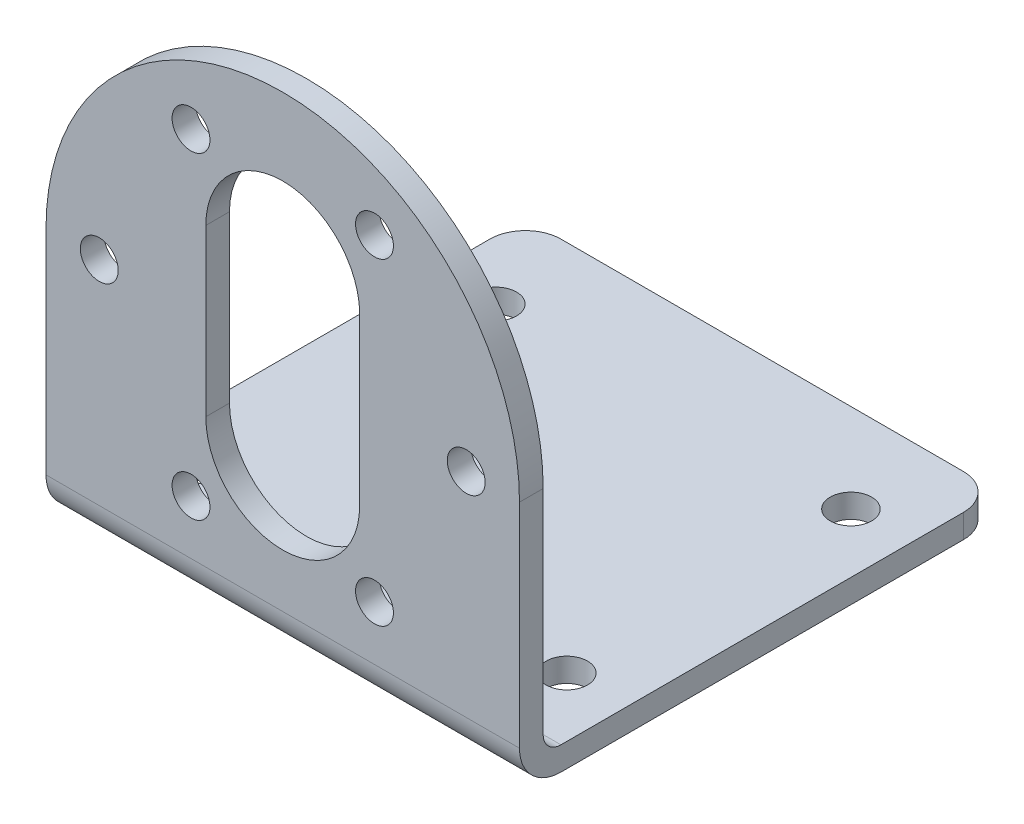
ISO-10303-21;
HEADER;
FILE_DESCRIPTION(('STEP AP214'),'2;1');
FILE_NAME('part.step','',(''),(''),'','','');
FILE_SCHEMA(('AUTOMOTIVE_DESIGN { 1 0 10303 214 1 1 1 1 }'));
ENDSEC;
DATA;
#1=APPLICATION_CONTEXT('core data for automotive mechanical design processes');
#2=APPLICATION_PROTOCOL_DEFINITION('international standard','automotive_design',2000,#1);
#3=PRODUCT_CONTEXT('',#1,'mechanical');
#4=PRODUCT('Part','Part','',(#3));
#5=PRODUCT_RELATED_PRODUCT_CATEGORY('part','',(#4));
#6=PRODUCT_DEFINITION_FORMATION('','',#4);
#7=PRODUCT_DEFINITION_CONTEXT('part definition',#1,'design');
#8=PRODUCT_DEFINITION('design','',#6,#7);
#9=PRODUCT_DEFINITION_SHAPE('','',#8);
#10=(LENGTH_UNIT() NAMED_UNIT(*) SI_UNIT(.MILLI.,.METRE.));
#11=(NAMED_UNIT(*) PLANE_ANGLE_UNIT() SI_UNIT($,.RADIAN.));
#12=(NAMED_UNIT(*) SI_UNIT($,.STERADIAN.) SOLID_ANGLE_UNIT());
#13=UNCERTAINTY_MEASURE_WITH_UNIT(LENGTH_MEASURE(1.E-05),#10,'distance_accuracy_value','');
#14=(GEOMETRIC_REPRESENTATION_CONTEXT(3) GLOBAL_UNCERTAINTY_ASSIGNED_CONTEXT((#13)) GLOBAL_UNIT_ASSIGNED_CONTEXT((#10,
#11,#12)) REPRESENTATION_CONTEXT('',''));
#15=CARTESIAN_POINT('',(0.,0.,0.));
#16=DIRECTION('',(0.,0.,1.));
#17=DIRECTION('',(1.,0.,0.));
#18=AXIS2_PLACEMENT_3D('',#15,#16,#17);
#19=CARTESIAN_POINT('',(0.,19.5,-20.25));
#20=DIRECTION('',(0.,0.,1.));
#21=DIRECTION('',(1.,0.,0.));
#22=AXIS2_PLACEMENT_3D('',#19,#20,#21);
#23=CYLINDRICAL_SURFACE('',#22,20.);
#24=DIRECTION('',(0.,0.,1.));
#25=VECTOR('',#24,1.);
#26=CARTESIAN_POINT('',(20.,19.5,-20.25));
#27=LINE('',#26,#25);
#28=CARTESIAN_POINT('',(20.,19.5,18.25));
#29=VERTEX_POINT('',#28);
#30=CARTESIAN_POINT('',(20.,19.5,20.25));
#31=VERTEX_POINT('',#30);
#32=EDGE_CURVE('E143',#29,#31,#27,.T.);
#33=ORIENTED_EDGE('',*,*,#32,.F.);
#34=CARTESIAN_POINT('',(0.,19.5,18.25));
#35=DIRECTION('',(0.,0.,-1.));
#36=DIRECTION('',(-1.,0.,0.));
#37=AXIS2_PLACEMENT_3D('',#34,#35,#36);
#38=CIRCLE('',#37,20.);
#39=CARTESIAN_POINT('',(-20.,19.5,18.25));
#40=VERTEX_POINT('',#39);
#41=EDGE_CURVE('E136',#40,#29,#38,.T.);
#42=ORIENTED_EDGE('',*,*,#41,.F.);
#43=DIRECTION('',(0.,0.,1.));
#44=VECTOR('',#43,1.);
#45=CARTESIAN_POINT('',(-20.,19.5,-20.25));
#46=LINE('',#45,#44);
#47=CARTESIAN_POINT('',(-20.,19.5,20.25));
#48=VERTEX_POINT('',#47);
#49=EDGE_CURVE('E140',#40,#48,#46,.T.);
#50=ORIENTED_EDGE('',*,*,#49,.T.);
#51=CARTESIAN_POINT('',(0.,19.5,20.25));
#52=DIRECTION('',(0.,0.,1.));
#53=DIRECTION('',(1.,0.,0.));
#54=AXIS2_PLACEMENT_3D('',#51,#52,#53);
#55=CIRCLE('',#54,20.);
#56=EDGE_CURVE('E215',#31,#48,#55,.T.);
#57=ORIENTED_EDGE('',*,*,#56,.F.);
#58=EDGE_LOOP('',(#33,#42,#50,#57));
#59=FACE_BOUND('',#58,.T.);
#60=ADVANCED_FACE('F36',(#59),#23,.T.);
#61=CARTESIAN_POINT('',(7.74999999999999,32.9233937586588,20.25));
#62=DIRECTION('',(0.,0.,1.));
#63=DIRECTION('',(1.,0.,0.));
#64=AXIS2_PLACEMENT_3D('',#61,#62,#63);
#65=CYLINDRICAL_SURFACE('',#64,1.59999999999999);
#66=CARTESIAN_POINT('',(7.74999999999999,32.9233937586588,20.25));
#67=DIRECTION('',(0.,0.,1.));
#68=DIRECTION('',(1.,0.,0.));
#69=AXIS2_PLACEMENT_3D('',#66,#67,#68);
#70=CIRCLE('',#69,1.59999999999999);
#71=CARTESIAN_POINT('',(9.34999999999998,32.9233937586588,20.25));
#72=VERTEX_POINT('',#71);
#73=EDGE_CURVE('E298',#72,#72,#70,.T.);
#74=ORIENTED_EDGE('',*,*,#73,.T.);
#75=EDGE_LOOP('',(#74));
#76=FACE_BOUND('',#75,.T.);
#77=CARTESIAN_POINT('',(7.74999999999999,32.9233937586588,18.25));
#78=DIRECTION('',(0.,0.,-1.));
#79=DIRECTION('',(-1.,0.,0.));
#80=AXIS2_PLACEMENT_3D('',#77,#78,#79);
#81=CIRCLE('',#80,1.59999999999998);
#82=CARTESIAN_POINT('',(6.15000000000001,32.9233937586588,18.25));
#83=VERTEX_POINT('',#82);
#84=EDGE_CURVE('E324',#83,#83,#81,.T.);
#85=ORIENTED_EDGE('',*,*,#84,.T.);
#86=EDGE_LOOP('',(#85));
#87=FACE_BOUND('',#86,.T.);
#88=ADVANCED_FACE('F328',(#76,#87),#65,.F.);
#89=CARTESIAN_POINT('',(-15.5,19.5,20.25));
#90=DIRECTION('',(0.,0.,1.));
#91=DIRECTION('',(1.,0.,0.));
#92=AXIS2_PLACEMENT_3D('',#89,#90,#91);
#93=CYLINDRICAL_SURFACE('',#92,1.59999999999999);
#94=CARTESIAN_POINT('',(-15.5,19.5,20.25));
#95=DIRECTION('',(0.,0.,1.));
#96=DIRECTION('',(1.,0.,0.));
#97=AXIS2_PLACEMENT_3D('',#94,#95,#96);
#98=CIRCLE('',#97,1.59999999999999);
#99=CARTESIAN_POINT('',(-13.9,19.5,20.25));
#100=VERTEX_POINT('',#99);
#101=EDGE_CURVE('E304',#100,#100,#98,.T.);
#102=ORIENTED_EDGE('',*,*,#101,.T.);
#103=EDGE_LOOP('',(#102));
#104=FACE_BOUND('',#103,.T.);
#105=CARTESIAN_POINT('',(-15.5,19.5,18.25));
#106=DIRECTION('',(0.,0.,1.));
#107=DIRECTION('',(0.,-1.,0.));
#108=AXIS2_PLACEMENT_3D('',#105,#106,#107);
#109=CIRCLE('',#108,1.59999999999999);
#110=CARTESIAN_POINT('',(-15.5,17.9,18.25));
#111=VERTEX_POINT('',#110);
#112=EDGE_CURVE('E301',#111,#111,#109,.T.);
#113=ORIENTED_EDGE('',*,*,#112,.F.);
#114=EDGE_LOOP('',(#113));
#115=FACE_BOUND('',#114,.T.);
#116=ADVANCED_FACE('F350',(#104,#115),#93,.F.);
#117=CARTESIAN_POINT('',(15.5,19.5,20.25));
#118=DIRECTION('',(0.,0.,1.));
#119=DIRECTION('',(1.,0.,0.));
#120=AXIS2_PLACEMENT_3D('',#117,#118,#119);
#121=CYLINDRICAL_SURFACE('',#120,1.59999999999999);
#122=CARTESIAN_POINT('',(15.5,19.5,20.25));
#123=DIRECTION('',(0.,0.,1.));
#124=DIRECTION('',(1.,0.,0.));
#125=AXIS2_PLACEMENT_3D('',#122,#123,#124);
#126=CIRCLE('',#125,1.59999999999999);
#127=CARTESIAN_POINT('',(17.1,19.5,20.25));
#128=VERTEX_POINT('',#127);
#129=EDGE_CURVE('E178',#128,#128,#126,.T.);
#130=ORIENTED_EDGE('',*,*,#129,.T.);
#131=EDGE_LOOP('',(#130));
#132=FACE_BOUND('',#131,.T.);
#133=CARTESIAN_POINT('',(15.5,19.5,18.25));
#134=DIRECTION('',(0.,0.,1.));
#135=DIRECTION('',(0.,-1.,0.));
#136=AXIS2_PLACEMENT_3D('',#133,#134,#135);
#137=CIRCLE('',#136,1.59999999999999);
#138=CARTESIAN_POINT('',(15.5,17.9,18.25));
#139=VERTEX_POINT('',#138);
#140=EDGE_CURVE('E313',#139,#139,#137,.T.);
#141=ORIENTED_EDGE('',*,*,#140,.F.);
#142=EDGE_LOOP('',(#141));
#143=FACE_BOUND('',#142,.T.);
#144=ADVANCED_FACE('F381',(#132,#143),#121,.F.);
#145=CARTESIAN_POINT('',(-7.75000000000001,32.9233937586588,20.25));
#146=DIRECTION('',(0.,0.,1.));
#147=DIRECTION('',(1.,0.,0.));
#148=AXIS2_PLACEMENT_3D('',#145,#146,#147);
#149=CYLINDRICAL_SURFACE('',#148,1.59999999999998);
#150=CARTESIAN_POINT('',(-7.75000000000001,32.9233937586588,20.25));
#151=DIRECTION('',(0.,0.,1.));
#152=DIRECTION('',(1.,0.,0.));
#153=AXIS2_PLACEMENT_3D('',#150,#151,#152);
#154=CIRCLE('',#153,1.59999999999999);
#155=CARTESIAN_POINT('',(-6.15000000000002,32.9233937586588,20.25));
#156=VERTEX_POINT('',#155);
#157=EDGE_CURVE('E147',#156,#156,#154,.T.);
#158=ORIENTED_EDGE('',*,*,#157,.T.);
#159=EDGE_LOOP('',(#158));
#160=FACE_BOUND('',#159,.T.);
#161=CARTESIAN_POINT('',(-7.75000000000001,32.9233937586588,18.25));
#162=DIRECTION('',(0.,0.,-1.));
#163=DIRECTION('',(-1.,0.,0.));
#164=AXIS2_PLACEMENT_3D('',#161,#162,#163);
#165=CIRCLE('',#164,1.59999999999998);
#166=CARTESIAN_POINT('',(-9.34999999999999,32.9233937586588,18.25));
#167=VERTEX_POINT('',#166);
#168=EDGE_CURVE('E148',#167,#167,#165,.T.);
#169=ORIENTED_EDGE('',*,*,#168,.T.);
#170=EDGE_LOOP('',(#169));
#171=FACE_BOUND('',#170,.T.);
#172=ADVANCED_FACE('F377',(#160,#171),#149,.F.);
#173=CARTESIAN_POINT('',(0.,19.5,-20.25));
#174=DIRECTION('',(0.,0.,1.));
#175=DIRECTION('',(1.,0.,0.));
#176=AXIS2_PLACEMENT_3D('',#173,#174,#175);
#177=PLANE('',#176);
#178=DIRECTION('',(1.,0.,0.));
#179=VECTOR('',#178,1.);
#180=CARTESIAN_POINT('',(-20.,0.,-20.25));
#181=LINE('',#180,#179);
#182=CARTESIAN_POINT('',(-17.,0.,-20.25));
#183=VERTEX_POINT('',#182);
#184=CARTESIAN_POINT('',(17.,0.,-20.25));
#185=VERTEX_POINT('',#184);
#186=EDGE_CURVE('E216',#183,#185,#181,.T.);
#187=ORIENTED_EDGE('',*,*,#186,.T.);
#188=DIRECTION('',(0.,1.,0.));
#189=VECTOR('',#188,1.);
#190=CARTESIAN_POINT('',(17.,-2.,-20.25));
#191=LINE('',#190,#189);
#192=CARTESIAN_POINT('',(17.,-2.,-20.25));
#193=VERTEX_POINT('',#192);
#194=EDGE_CURVE('E196',#185,#193,#191,.F.);
#195=ORIENTED_EDGE('',*,*,#194,.T.);
#196=DIRECTION('',(1.,0.,0.));
#197=VECTOR('',#196,1.);
#198=CARTESIAN_POINT('',(-20.,-2.,-20.25));
#199=LINE('',#198,#197);
#200=CARTESIAN_POINT('',(-17.,-2.,-20.25));
#201=VERTEX_POINT('',#200);
#202=EDGE_CURVE('E174',#201,#193,#199,.T.);
#203=ORIENTED_EDGE('',*,*,#202,.F.);
#204=DIRECTION('',(0.,-1.,0.));
#205=VECTOR('',#204,1.);
#206=CARTESIAN_POINT('',(-17.,0.,-20.25));
#207=LINE('',#206,#205);
#208=EDGE_CURVE('E194',#201,#183,#207,.F.);
#209=ORIENTED_EDGE('',*,*,#208,.T.);
#210=EDGE_LOOP('',(#187,#195,#203,#209));
#211=FACE_BOUND('',#210,.T.);
#212=ADVANCED_FACE('F360',(#211),#177,.F.);
#213=CARTESIAN_POINT('',(-20.,-2.,-20.25));
#214=DIRECTION('',(0.,-1.,0.));
#215=DIRECTION('',(0.,0.,-1.));
#216=AXIS2_PLACEMENT_3D('',#213,#214,#215);
#217=PLANE('',#216);
#218=CARTESIAN_POINT('',(-15.,-2.,11.25));
#219=DIRECTION('',(0.,-1.,0.));
#220=DIRECTION('',(0.,0.,-1.));
#221=AXIS2_PLACEMENT_3D('',#218,#219,#220);
#222=CIRCLE('',#221,1.74999999999998);
#223=CARTESIAN_POINT('',(-15.,-2.,9.50000000000002));
#224=VERTEX_POINT('',#223);
#225=EDGE_CURVE('E295',#224,#224,#222,.T.);
#226=ORIENTED_EDGE('',*,*,#225,.F.);
#227=EDGE_LOOP('',(#226));
#228=FACE_BOUND('',#227,.T.);
#229=CARTESIAN_POINT('',(-15.,-2.,-12.75));
#230=DIRECTION('',(0.,-1.,0.));
#231=DIRECTION('',(0.,0.,-1.));
#232=AXIS2_PLACEMENT_3D('',#229,#230,#231);
#233=CIRCLE('',#232,1.74999999999998);
#234=CARTESIAN_POINT('',(-15.,-2.,-14.5));
#235=VERTEX_POINT('',#234);
#236=EDGE_CURVE('E289',#235,#235,#233,.T.);
#237=ORIENTED_EDGE('',*,*,#236,.F.);
#238=EDGE_LOOP('',(#237));
#239=FACE_BOUND('',#238,.T.);
#240=CARTESIAN_POINT('',(15.,-2.,-12.75));
#241=DIRECTION('',(0.,-1.,0.));
#242=DIRECTION('',(0.,0.,-1.));
#243=AXIS2_PLACEMENT_3D('',#240,#241,#242);
#244=CIRCLE('',#243,1.74999999999998);
#245=CARTESIAN_POINT('',(15.,-2.,-14.5));
#246=VERTEX_POINT('',#245);
#247=EDGE_CURVE('E283',#246,#246,#244,.T.);
#248=ORIENTED_EDGE('',*,*,#247,.F.);
#249=EDGE_LOOP('',(#248));
#250=FACE_BOUND('',#249,.T.);
#251=CARTESIAN_POINT('',(15.,-2.,11.25));
#252=DIRECTION('',(0.,-1.,0.));
#253=DIRECTION('',(0.,0.,-1.));
#254=AXIS2_PLACEMENT_3D('',#251,#252,#253);
#255=CIRCLE('',#254,1.74999999999998);
#256=CARTESIAN_POINT('',(15.,-2.,9.50000000000002));
#257=VERTEX_POINT('',#256);
#258=EDGE_CURVE('E277',#257,#257,#255,.T.);
#259=ORIENTED_EDGE('',*,*,#258,.F.);
#260=EDGE_LOOP('',(#259));
#261=FACE_BOUND('',#260,.T.);
#262=DIRECTION('',(0.,0.,1.));
#263=VECTOR('',#262,1.);
#264=CARTESIAN_POINT('',(20.,-2.,-20.25));
#265=LINE('',#264,#263);
#266=CARTESIAN_POINT('',(20.,-2.,-17.25));
#267=VERTEX_POINT('',#266);
#268=CARTESIAN_POINT('',(20.,-2.,16.75));
#269=VERTEX_POINT('',#268);
#270=EDGE_CURVE('E169',#267,#269,#265,.T.);
#271=ORIENTED_EDGE('',*,*,#270,.T.);
#272=DIRECTION('',(1.,0.,0.));
#273=VECTOR('',#272,1.);
#274=CARTESIAN_POINT('',(-20.,-2.,16.75));
#275=LINE('',#274,#273);
#276=CARTESIAN_POINT('',(-20.,-2.,16.75));
#277=VERTEX_POINT('',#276);
#278=EDGE_CURVE('E44',#269,#277,#275,.F.);
#279=ORIENTED_EDGE('',*,*,#278,.T.);
#280=DIRECTION('',(0.,0.,1.));
#281=VECTOR('',#280,1.);
#282=CARTESIAN_POINT('',(-20.,-2.,-20.25));
#283=LINE('',#282,#281);
#284=CARTESIAN_POINT('',(-20.,-2.,-17.25));
#285=VERTEX_POINT('',#284);
#286=EDGE_CURVE('E165',#285,#277,#283,.T.);
#287=ORIENTED_EDGE('',*,*,#286,.F.);
#288=CARTESIAN_POINT('',(-17.,-2.,-17.25));
#289=DIRECTION('',(0.,-1.,0.));
#290=DIRECTION('',(0.,0.,-1.));
#291=AXIS2_PLACEMENT_3D('',#288,#289,#290);
#292=CIRCLE('',#291,3.);
#293=EDGE_CURVE('E198',#285,#201,#292,.T.);
#294=ORIENTED_EDGE('',*,*,#293,.T.);
#295=ORIENTED_EDGE('',*,*,#202,.T.);
#296=CARTESIAN_POINT('',(17.,-2.,-17.25));
#297=DIRECTION('',(0.,-1.,0.));
#298=DIRECTION('',(0.,0.,-1.));
#299=AXIS2_PLACEMENT_3D('',#296,#297,#298);
#300=CIRCLE('',#299,3.);
#301=EDGE_CURVE('E200',#193,#267,#300,.T.);
#302=ORIENTED_EDGE('',*,*,#301,.T.);
#303=EDGE_LOOP('',(#271,#279,#287,#294,#295,#302));
#304=FACE_BOUND('',#303,.T.);
#305=ADVANCED_FACE('F225',(#228,#239,#250,#261,#304),#217,.T.);
#306=CARTESIAN_POINT('',(-20.,19.5,-20.25));
#307=DIRECTION('',(-1.,0.,0.));
#308=DIRECTION('',(0.,0.,1.));
#309=AXIS2_PLACEMENT_3D('',#306,#307,#308);
#310=PLANE('',#309);
#311=ORIENTED_EDGE('',*,*,#286,.T.);
#312=CARTESIAN_POINT('',(-20.,1.5,16.75));
#313=DIRECTION('',(-1.,0.,0.));
#314=DIRECTION('',(0.,0.,1.));
#315=AXIS2_PLACEMENT_3D('',#312,#313,#314);
#316=CIRCLE('',#315,3.5);
#317=CARTESIAN_POINT('',(-20.,1.5,20.25));
#318=VERTEX_POINT('',#317);
#319=EDGE_CURVE('E11',#277,#318,#316,.T.);
#320=ORIENTED_EDGE('',*,*,#319,.T.);
#321=DIRECTION('',(0.,-1.,0.));
#322=VECTOR('',#321,1.);
#323=CARTESIAN_POINT('',(-20.,19.5,20.25));
#324=LINE('',#323,#322);
#325=EDGE_CURVE('E164',#48,#318,#324,.T.);
#326=ORIENTED_EDGE('',*,*,#325,.F.);
#327=ORIENTED_EDGE('',*,*,#49,.F.);
#328=DIRECTION('',(0.,-1.,0.));
#329=VECTOR('',#328,1.);
#330=CARTESIAN_POINT('',(-20.,19.5,18.25));
#331=LINE('',#330,#329);
#332=CARTESIAN_POINT('',(-20.,1.49999999999999,18.25));
#333=VERTEX_POINT('',#332);
#334=EDGE_CURVE('E151',#40,#333,#331,.T.);
#335=ORIENTED_EDGE('',*,*,#334,.T.);
#336=CARTESIAN_POINT('',(-20.,1.49999999999999,16.75));
#337=DIRECTION('',(-1.,0.,0.));
#338=DIRECTION('',(0.,0.,1.));
#339=AXIS2_PLACEMENT_3D('',#336,#337,#338);
#340=CIRCLE('',#339,1.5);
#341=CARTESIAN_POINT('',(-20.,0.,16.75));
#342=VERTEX_POINT('',#341);
#343=EDGE_CURVE('E185',#333,#342,#340,.F.);
#344=ORIENTED_EDGE('',*,*,#343,.T.);
#345=DIRECTION('',(0.,0.,-1.));
#346=VECTOR('',#345,1.);
#347=CARTESIAN_POINT('',(-20.,0.,18.25));
#348=LINE('',#347,#346);
#349=CARTESIAN_POINT('',(-20.,0.,-17.25));
#350=VERTEX_POINT('',#349);
#351=EDGE_CURVE('E158',#342,#350,#348,.T.);
#352=ORIENTED_EDGE('',*,*,#351,.T.);
#353=DIRECTION('',(0.,-1.,0.));
#354=VECTOR('',#353,1.);
#355=CARTESIAN_POINT('',(-20.,-2.,-17.25));
#356=LINE('',#355,#354);
#357=EDGE_CURVE('E202',#350,#285,#356,.T.);
#358=ORIENTED_EDGE('',*,*,#357,.T.);
#359=EDGE_LOOP('',(#311,#320,#326,#327,#335,#344,#352,#358));
#360=FACE_BOUND('',#359,.T.);
#361=ADVANCED_FACE('F162',(#360),#310,.T.);
#362=CARTESIAN_POINT('',(20.,-2.,-20.25));
#363=DIRECTION('',(1.,0.,0.));
#364=DIRECTION('',(0.,1.,0.));
#365=AXIS2_PLACEMENT_3D('',#362,#363,#364);
#366=PLANE('',#365);
#367=DIRECTION('',(0.,1.,0.));
#368=VECTOR('',#367,1.);
#369=CARTESIAN_POINT('',(20.,-2.,20.25));
#370=LINE('',#369,#368);
#371=CARTESIAN_POINT('',(20.,1.5,20.25));
#372=VERTEX_POINT('',#371);
#373=EDGE_CURVE('E211',#372,#31,#370,.T.);
#374=ORIENTED_EDGE('',*,*,#373,.F.);
#375=CARTESIAN_POINT('',(20.,1.5,16.75));
#376=DIRECTION('',(1.,0.,0.));
#377=DIRECTION('',(0.,1.,0.));
#378=AXIS2_PLACEMENT_3D('',#375,#376,#377);
#379=CIRCLE('',#378,3.5);
#380=EDGE_CURVE('E58',#372,#269,#379,.T.);
#381=ORIENTED_EDGE('',*,*,#380,.T.);
#382=ORIENTED_EDGE('',*,*,#270,.F.);
#383=DIRECTION('',(0.,1.,0.));
#384=VECTOR('',#383,1.);
#385=CARTESIAN_POINT('',(20.,0.,-17.25));
#386=LINE('',#385,#384);
#387=CARTESIAN_POINT('',(20.,0.,-17.25));
#388=VERTEX_POINT('',#387);
#389=EDGE_CURVE('E187',#267,#388,#386,.T.);
#390=ORIENTED_EDGE('',*,*,#389,.T.);
#391=DIRECTION('',(0.,0.,-1.));
#392=VECTOR('',#391,1.);
#393=CARTESIAN_POINT('',(20.,0.,18.25));
#394=LINE('',#393,#392);
#395=CARTESIAN_POINT('',(20.,0.,16.75));
#396=VERTEX_POINT('',#395);
#397=EDGE_CURVE('E159',#396,#388,#394,.T.);
#398=ORIENTED_EDGE('',*,*,#397,.F.);
#399=CARTESIAN_POINT('',(20.,1.5,16.75));
#400=DIRECTION('',(1.,0.,0.));
#401=DIRECTION('',(0.,1.,0.));
#402=AXIS2_PLACEMENT_3D('',#399,#400,#401);
#403=CIRCLE('',#402,1.5);
#404=CARTESIAN_POINT('',(20.,1.5,18.25));
#405=VERTEX_POINT('',#404);
#406=EDGE_CURVE('E183',#396,#405,#403,.F.);
#407=ORIENTED_EDGE('',*,*,#406,.T.);
#408=DIRECTION('',(0.,-1.,0.));
#409=VECTOR('',#408,1.);
#410=CARTESIAN_POINT('',(20.,19.5,18.25));
#411=LINE('',#410,#409);
#412=EDGE_CURVE('E239',#29,#405,#411,.T.);
#413=ORIENTED_EDGE('',*,*,#412,.F.);
#414=ORIENTED_EDGE('',*,*,#32,.T.);
#415=EDGE_LOOP('',(#374,#381,#382,#390,#398,#407,#413,#414));
#416=FACE_BOUND('',#415,.T.);
#417=ADVANCED_FACE('F214',(#416),#366,.T.);
#418=CARTESIAN_POINT('',(0.,19.5,20.25));
#419=DIRECTION('',(0.,0.,1.));
#420=DIRECTION('',(1.,0.,0.));
#421=AXIS2_PLACEMENT_3D('',#418,#419,#420);
#422=PLANE('',#421);
#423=ORIENTED_EDGE('',*,*,#157,.F.);
#424=EDGE_LOOP('',(#423));
#425=FACE_BOUND('',#424,.T.);
#426=CARTESIAN_POINT('',(-7.75,6.07660624134119,20.25));
#427=DIRECTION('',(0.,0.,1.));
#428=DIRECTION('',(1.,0.,0.));
#429=AXIS2_PLACEMENT_3D('',#426,#427,#428);
#430=CIRCLE('',#429,1.59999999999999);
#431=CARTESIAN_POINT('',(-6.15000000000001,6.07660624134119,20.25));
#432=VERTEX_POINT('',#431);
#433=EDGE_CURVE('E179',#432,#432,#430,.T.);
#434=ORIENTED_EDGE('',*,*,#433,.F.);
#435=EDGE_LOOP('',(#434));
#436=FACE_BOUND('',#435,.T.);
#437=ORIENTED_EDGE('',*,*,#129,.F.);
#438=EDGE_LOOP('',(#437));
#439=FACE_BOUND('',#438,.T.);
#440=CARTESIAN_POINT('',(7.75,6.0766062413412,20.25));
#441=DIRECTION('',(0.,0.,1.));
#442=DIRECTION('',(1.,0.,0.));
#443=AXIS2_PLACEMENT_3D('',#440,#441,#442);
#444=CIRCLE('',#443,1.59999999999999);
#445=CARTESIAN_POINT('',(9.34999999999999,6.0766062413412,20.25));
#446=VERTEX_POINT('',#445);
#447=EDGE_CURVE('E310',#446,#446,#444,.T.);
#448=ORIENTED_EDGE('',*,*,#447,.F.);
#449=EDGE_LOOP('',(#448));
#450=FACE_BOUND('',#449,.T.);
#451=ORIENTED_EDGE('',*,*,#101,.F.);
#452=EDGE_LOOP('',(#451));
#453=FACE_BOUND('',#452,.T.);
#454=ORIENTED_EDGE('',*,*,#73,.F.);
#455=EDGE_LOOP('',(#454));
#456=FACE_BOUND('',#455,.T.);
#457=CARTESIAN_POINT('',(0.,26.5,20.25));
#458=DIRECTION('',(0.,0.,1.));
#459=DIRECTION('',(1.,0.,0.));
#460=AXIS2_PLACEMENT_3D('',#457,#458,#459);
#461=CIRCLE('',#460,6.5);
#462=CARTESIAN_POINT('',(6.49999999999999,26.5,20.25));
#463=VERTEX_POINT('',#462);
#464=CARTESIAN_POINT('',(-6.50000000000001,26.5,20.25));
#465=VERTEX_POINT('',#464);
#466=EDGE_CURVE('E265',#463,#465,#461,.T.);
#467=ORIENTED_EDGE('',*,*,#466,.F.);
#468=DIRECTION('',(0.,1.,0.));
#469=VECTOR('',#468,1.);
#470=CARTESIAN_POINT('',(6.5,12.5,20.25));
#471=LINE('',#470,#469);
#472=CARTESIAN_POINT('',(6.5,12.5,20.25));
#473=VERTEX_POINT('',#472);
#474=EDGE_CURVE('E255',#473,#463,#471,.T.);
#475=ORIENTED_EDGE('',*,*,#474,.F.);
#476=CARTESIAN_POINT('',(0.,12.5,20.25));
#477=DIRECTION('',(0.,0.,1.));
#478=DIRECTION('',(1.,0.,0.));
#479=AXIS2_PLACEMENT_3D('',#476,#477,#478);
#480=CIRCLE('',#479,6.5);
#481=CARTESIAN_POINT('',(-6.5,12.5,20.25));
#482=VERTEX_POINT('',#481);
#483=EDGE_CURVE('E259',#482,#473,#480,.T.);
#484=ORIENTED_EDGE('',*,*,#483,.F.);
#485=DIRECTION('',(0.,-1.,0.));
#486=VECTOR('',#485,1.);
#487=CARTESIAN_POINT('',(-6.50000000000001,26.5,20.25));
#488=LINE('',#487,#486);
#489=EDGE_CURVE('E262',#465,#482,#488,.T.);
#490=ORIENTED_EDGE('',*,*,#489,.F.);
#491=EDGE_LOOP('',(#467,#475,#484,#490));
#492=FACE_BOUND('',#491,.T.);
#493=ORIENTED_EDGE('',*,*,#325,.T.);
#494=DIRECTION('',(1.,0.,0.));
#495=VECTOR('',#494,1.);
#496=CARTESIAN_POINT('',(0.,1.5,20.25));
#497=LINE('',#496,#495);
#498=EDGE_CURVE('E205',#318,#372,#497,.T.);
#499=ORIENTED_EDGE('',*,*,#498,.T.);
#500=ORIENTED_EDGE('',*,*,#373,.T.);
#501=ORIENTED_EDGE('',*,*,#56,.T.);
#502=EDGE_LOOP('',(#493,#499,#500,#501));
#503=FACE_BOUND('',#502,.T.);
#504=ADVANCED_FACE('F210',(#425,#436,#439,#450,#453,#456,#492,#503),#422,.T.);
#505=CARTESIAN_POINT('',(-20.,0.,18.25));
#506=DIRECTION('',(0.,-1.,0.));
#507=DIRECTION('',(1.,0.,0.));
#508=AXIS2_PLACEMENT_3D('',#505,#506,#507);
#509=PLANE('',#508);
#510=CARTESIAN_POINT('',(-15.,0.,11.25));
#511=DIRECTION('',(0.,-1.,0.));
#512=DIRECTION('',(1.,0.,0.));
#513=AXIS2_PLACEMENT_3D('',#510,#511,#512);
#514=CIRCLE('',#513,1.74999999999999);
#515=CARTESIAN_POINT('',(-13.25,0.,11.25));
#516=VERTEX_POINT('',#515);
#517=EDGE_CURVE('E292',#516,#516,#514,.T.);
#518=ORIENTED_EDGE('',*,*,#517,.T.);
#519=EDGE_LOOP('',(#518));
#520=FACE_BOUND('',#519,.T.);
#521=CARTESIAN_POINT('',(-15.,0.,-12.75));
#522=DIRECTION('',(0.,-1.,0.));
#523=DIRECTION('',(1.,0.,0.));
#524=AXIS2_PLACEMENT_3D('',#521,#522,#523);
#525=CIRCLE('',#524,1.74999999999999);
#526=CARTESIAN_POINT('',(-13.25,0.,-12.75));
#527=VERTEX_POINT('',#526);
#528=EDGE_CURVE('E286',#527,#527,#525,.T.);
#529=ORIENTED_EDGE('',*,*,#528,.T.);
#530=EDGE_LOOP('',(#529));
#531=FACE_BOUND('',#530,.T.);
#532=CARTESIAN_POINT('',(15.,0.,-12.75));
#533=DIRECTION('',(0.,-1.,0.));
#534=DIRECTION('',(1.,0.,0.));
#535=AXIS2_PLACEMENT_3D('',#532,#533,#534);
#536=CIRCLE('',#535,1.74999999999999);
#537=CARTESIAN_POINT('',(16.75,0.,-12.75));
#538=VERTEX_POINT('',#537);
#539=EDGE_CURVE('E280',#538,#538,#536,.T.);
#540=ORIENTED_EDGE('',*,*,#539,.T.);
#541=EDGE_LOOP('',(#540));
#542=FACE_BOUND('',#541,.T.);
#543=CARTESIAN_POINT('',(15.,0.,11.25));
#544=DIRECTION('',(0.,-1.,0.));
#545=DIRECTION('',(1.,0.,0.));
#546=AXIS2_PLACEMENT_3D('',#543,#544,#545);
#547=CIRCLE('',#546,1.74999999999999);
#548=CARTESIAN_POINT('',(16.75,0.,11.25));
#549=VERTEX_POINT('',#548);
#550=EDGE_CURVE('E267',#549,#549,#547,.T.);
#551=ORIENTED_EDGE('',*,*,#550,.T.);
#552=EDGE_LOOP('',(#551));
#553=FACE_BOUND('',#552,.T.);
#554=ORIENTED_EDGE('',*,*,#397,.T.);
#555=CARTESIAN_POINT('',(17.,0.,-17.25));
#556=DIRECTION('',(0.,-1.,0.));
#557=DIRECTION('',(1.,0.,0.));
#558=AXIS2_PLACEMENT_3D('',#555,#556,#557);
#559=CIRCLE('',#558,3.);
#560=EDGE_CURVE('E192',#388,#185,#559,.F.);
#561=ORIENTED_EDGE('',*,*,#560,.T.);
#562=ORIENTED_EDGE('',*,*,#186,.F.);
#563=CARTESIAN_POINT('',(-17.,0.,-17.25));
#564=DIRECTION('',(0.,-1.,0.));
#565=DIRECTION('',(1.,0.,0.));
#566=AXIS2_PLACEMENT_3D('',#563,#564,#565);
#567=CIRCLE('',#566,3.);
#568=EDGE_CURVE('E190',#183,#350,#567,.F.);
#569=ORIENTED_EDGE('',*,*,#568,.T.);
#570=ORIENTED_EDGE('',*,*,#351,.F.);
#571=DIRECTION('',(1.,0.,0.));
#572=VECTOR('',#571,1.);
#573=CARTESIAN_POINT('',(20.,0.,16.75));
#574=LINE('',#573,#572);
#575=EDGE_CURVE('E167',#342,#396,#574,.T.);
#576=ORIENTED_EDGE('',*,*,#575,.T.);
#577=EDGE_LOOP('',(#554,#561,#562,#569,#570,#576));
#578=FACE_BOUND('',#577,.T.);
#579=ADVANCED_FACE('F235',(#520,#531,#542,#553,#578),#509,.F.);
#580=CARTESIAN_POINT('',(-20.,19.5,18.25));
#581=DIRECTION('',(0.,0.,1.));
#582=DIRECTION('',(0.,-1.,0.));
#583=AXIS2_PLACEMENT_3D('',#580,#581,#582);
#584=PLANE('',#583);
#585=ORIENTED_EDGE('',*,*,#112,.T.);
#586=EDGE_LOOP('',(#585));
#587=FACE_BOUND('',#586,.T.);
#588=DIRECTION('',(0.,-1.,0.));
#589=VECTOR('',#588,1.);
#590=CARTESIAN_POINT('',(-6.50000000000001,26.5,18.25));
#591=LINE('',#590,#589);
#592=CARTESIAN_POINT('',(-6.50000000000001,26.5,18.25));
#593=VERTEX_POINT('',#592);
#594=CARTESIAN_POINT('',(-6.5,12.5,18.25));
#595=VERTEX_POINT('',#594);
#596=EDGE_CURVE('E272',#593,#595,#591,.T.);
#597=ORIENTED_EDGE('',*,*,#596,.T.);
#598=CARTESIAN_POINT('',(0.,12.5,18.25));
#599=DIRECTION('',(0.,0.,1.));
#600=DIRECTION('',(1.,0.,0.));
#601=AXIS2_PLACEMENT_3D('',#598,#599,#600);
#602=CIRCLE('',#601,6.5);
#603=CARTESIAN_POINT('',(6.5,12.5,18.25));
#604=VERTEX_POINT('',#603);
#605=EDGE_CURVE('E269',#595,#604,#602,.T.);
#606=ORIENTED_EDGE('',*,*,#605,.T.);
#607=DIRECTION('',(0.,1.,0.));
#608=VECTOR('',#607,1.);
#609=CARTESIAN_POINT('',(6.5,12.5,18.25));
#610=LINE('',#609,#608);
#611=CARTESIAN_POINT('',(6.49999999999999,26.5,18.25));
#612=VERTEX_POINT('',#611);
#613=EDGE_CURVE('E250',#604,#612,#610,.T.);
#614=ORIENTED_EDGE('',*,*,#613,.T.);
#615=CARTESIAN_POINT('',(0.,26.5,18.25));
#616=DIRECTION('',(0.,0.,1.));
#617=DIRECTION('',(1.,0.,0.));
#618=AXIS2_PLACEMENT_3D('',#615,#616,#617);
#619=CIRCLE('',#618,6.5);
#620=EDGE_CURVE('E258',#612,#593,#619,.T.);
#621=ORIENTED_EDGE('',*,*,#620,.T.);
#622=EDGE_LOOP('',(#597,#606,#614,#621));
#623=FACE_BOUND('',#622,.T.);
#624=ORIENTED_EDGE('',*,*,#140,.T.);
#625=EDGE_LOOP('',(#624));
#626=FACE_BOUND('',#625,.T.);
#627=CARTESIAN_POINT('',(-7.75,6.07660624134119,18.25));
#628=DIRECTION('',(0.,0.,1.));
#629=DIRECTION('',(0.,-1.,0.));
#630=AXIS2_PLACEMENT_3D('',#627,#628,#629);
#631=CIRCLE('',#630,1.59999999999998);
#632=CARTESIAN_POINT('',(-7.75,4.47660624134121,18.25));
#633=VERTEX_POINT('',#632);
#634=EDGE_CURVE('E175',#633,#633,#631,.T.);
#635=ORIENTED_EDGE('',*,*,#634,.T.);
#636=EDGE_LOOP('',(#635));
#637=FACE_BOUND('',#636,.T.);
#638=CARTESIAN_POINT('',(7.75,6.0766062413412,18.25));
#639=DIRECTION('',(0.,0.,1.));
#640=DIRECTION('',(0.,-1.,0.));
#641=AXIS2_PLACEMENT_3D('',#638,#639,#640);
#642=CIRCLE('',#641,1.59999999999999);
#643=CARTESIAN_POINT('',(7.75,4.47660624134121,18.25));
#644=VERTEX_POINT('',#643);
#645=EDGE_CURVE('E307',#644,#644,#642,.T.);
#646=ORIENTED_EDGE('',*,*,#645,.T.);
#647=EDGE_LOOP('',(#646));
#648=FACE_BOUND('',#647,.T.);
#649=ORIENTED_EDGE('',*,*,#412,.T.);
#650=DIRECTION('',(1.,0.,0.));
#651=VECTOR('',#650,1.);
#652=CARTESIAN_POINT('',(-20.,1.5,18.25));
#653=LINE('',#652,#651);
#654=EDGE_CURVE('E155',#405,#333,#653,.F.);
#655=ORIENTED_EDGE('',*,*,#654,.T.);
#656=ORIENTED_EDGE('',*,*,#334,.F.);
#657=ORIENTED_EDGE('',*,*,#41,.T.);
#658=EDGE_LOOP('',(#649,#655,#656,#657));
#659=FACE_BOUND('',#658,.T.);
#660=ORIENTED_EDGE('',*,*,#168,.F.);
#661=EDGE_LOOP('',(#660));
#662=FACE_BOUND('',#661,.T.);
#663=ORIENTED_EDGE('',*,*,#84,.F.);
#664=EDGE_LOOP('',(#663));
#665=FACE_BOUND('',#664,.T.);
#666=ADVANCED_FACE('F152',(#587,#623,#626,#637,#648,#659,#662,#665),#584,.F.);
#667=CARTESIAN_POINT('',(0.,26.5,18.25));
#668=DIRECTION('',(0.,0.,1.));
#669=DIRECTION('',(1.,0.,0.));
#670=AXIS2_PLACEMENT_3D('',#667,#668,#669);
#671=CYLINDRICAL_SURFACE('',#670,6.5);
#672=ORIENTED_EDGE('',*,*,#466,.T.);
#673=DIRECTION('',(0.,0.,1.));
#674=VECTOR('',#673,1.);
#675=CARTESIAN_POINT('',(-6.50000000000001,26.5,18.25));
#676=LINE('',#675,#674);
#677=EDGE_CURVE('E246',#593,#465,#676,.T.);
#678=ORIENTED_EDGE('',*,*,#677,.F.);
#679=ORIENTED_EDGE('',*,*,#620,.F.);
#680=DIRECTION('',(0.,0.,1.));
#681=VECTOR('',#680,1.);
#682=CARTESIAN_POINT('',(6.49999999999999,26.5,18.25));
#683=LINE('',#682,#681);
#684=EDGE_CURVE('E241',#612,#463,#683,.T.);
#685=ORIENTED_EDGE('',*,*,#684,.T.);
#686=EDGE_LOOP('',(#672,#678,#679,#685));
#687=FACE_BOUND('',#686,.T.);
#688=ADVANCED_FACE('F331',(#687),#671,.F.);
#689=CARTESIAN_POINT('',(6.5,12.5,18.25));
#690=DIRECTION('',(1.,0.,0.));
#691=DIRECTION('',(0.,1.,0.));
#692=AXIS2_PLACEMENT_3D('',#689,#690,#691);
#693=PLANE('',#692);
#694=ORIENTED_EDGE('',*,*,#474,.T.);
#695=ORIENTED_EDGE('',*,*,#684,.F.);
#696=ORIENTED_EDGE('',*,*,#613,.F.);
#697=DIRECTION('',(0.,0.,1.));
#698=VECTOR('',#697,1.);
#699=CARTESIAN_POINT('',(6.5,12.5,18.25));
#700=LINE('',#699,#698);
#701=EDGE_CURVE('E252',#604,#473,#700,.T.);
#702=ORIENTED_EDGE('',*,*,#701,.T.);
#703=EDGE_LOOP('',(#694,#695,#696,#702));
#704=FACE_BOUND('',#703,.T.);
#705=ADVANCED_FACE('F338',(#704),#693,.F.);
#706=CARTESIAN_POINT('',(0.,12.5,18.25));
#707=DIRECTION('',(0.,0.,1.));
#708=DIRECTION('',(1.,0.,0.));
#709=AXIS2_PLACEMENT_3D('',#706,#707,#708);
#710=CYLINDRICAL_SURFACE('',#709,6.5);
#711=ORIENTED_EDGE('',*,*,#483,.T.);
#712=ORIENTED_EDGE('',*,*,#701,.F.);
#713=ORIENTED_EDGE('',*,*,#605,.F.);
#714=DIRECTION('',(0.,0.,1.));
#715=VECTOR('',#714,1.);
#716=CARTESIAN_POINT('',(-6.5,12.5,18.25));
#717=LINE('',#716,#715);
#718=EDGE_CURVE('E249',#595,#482,#717,.T.);
#719=ORIENTED_EDGE('',*,*,#718,.T.);
#720=EDGE_LOOP('',(#711,#712,#713,#719));
#721=FACE_BOUND('',#720,.T.);
#722=ADVANCED_FACE('F416',(#721),#710,.F.);
#723=CARTESIAN_POINT('',(-6.50000000000001,26.5,18.25));
#724=DIRECTION('',(-1.,0.,0.));
#725=DIRECTION('',(0.,-1.,0.));
#726=AXIS2_PLACEMENT_3D('',#723,#724,#725);
#727=PLANE('',#726);
#728=ORIENTED_EDGE('',*,*,#489,.T.);
#729=ORIENTED_EDGE('',*,*,#718,.F.);
#730=ORIENTED_EDGE('',*,*,#596,.F.);
#731=ORIENTED_EDGE('',*,*,#677,.T.);
#732=EDGE_LOOP('',(#728,#729,#730,#731));
#733=FACE_BOUND('',#732,.T.);
#734=ADVANCED_FACE('F409',(#733),#727,.F.);
#735=CARTESIAN_POINT('',(15.,-2.,11.25));
#736=DIRECTION('',(0.,-1.,0.));
#737=DIRECTION('',(0.,0.,-1.));
#738=AXIS2_PLACEMENT_3D('',#735,#736,#737);
#739=CYLINDRICAL_SURFACE('',#738,1.74999999999999);
#740=ORIENTED_EDGE('',*,*,#550,.F.);
#741=EDGE_LOOP('',(#740));
#742=FACE_BOUND('',#741,.T.);
#743=ORIENTED_EDGE('',*,*,#258,.T.);
#744=EDGE_LOOP('',(#743));
#745=FACE_BOUND('',#744,.T.);
#746=ADVANCED_FACE('F423',(#742,#745),#739,.F.);
#747=CARTESIAN_POINT('',(15.,-2.,-12.75));
#748=DIRECTION('',(0.,-1.,0.));
#749=DIRECTION('',(0.,0.,-1.));
#750=AXIS2_PLACEMENT_3D('',#747,#748,#749);
#751=CYLINDRICAL_SURFACE('',#750,1.74999999999999);
#752=ORIENTED_EDGE('',*,*,#539,.F.);
#753=EDGE_LOOP('',(#752));
#754=FACE_BOUND('',#753,.T.);
#755=ORIENTED_EDGE('',*,*,#247,.T.);
#756=EDGE_LOOP('',(#755));
#757=FACE_BOUND('',#756,.T.);
#758=ADVANCED_FACE('F429',(#754,#757),#751,.F.);
#759=CARTESIAN_POINT('',(-15.,-2.,-12.75));
#760=DIRECTION('',(0.,-1.,0.));
#761=DIRECTION('',(0.,0.,-1.));
#762=AXIS2_PLACEMENT_3D('',#759,#760,#761);
#763=CYLINDRICAL_SURFACE('',#762,1.74999999999999);
#764=ORIENTED_EDGE('',*,*,#528,.F.);
#765=EDGE_LOOP('',(#764));
#766=FACE_BOUND('',#765,.T.);
#767=ORIENTED_EDGE('',*,*,#236,.T.);
#768=EDGE_LOOP('',(#767));
#769=FACE_BOUND('',#768,.T.);
#770=ADVANCED_FACE('F433',(#766,#769),#763,.F.);
#771=CARTESIAN_POINT('',(-15.,-2.,11.25));
#772=DIRECTION('',(0.,-1.,0.));
#773=DIRECTION('',(0.,0.,-1.));
#774=AXIS2_PLACEMENT_3D('',#771,#772,#773);
#775=CYLINDRICAL_SURFACE('',#774,1.74999999999999);
#776=ORIENTED_EDGE('',*,*,#517,.F.);
#777=EDGE_LOOP('',(#776));
#778=FACE_BOUND('',#777,.T.);
#779=ORIENTED_EDGE('',*,*,#225,.T.);
#780=EDGE_LOOP('',(#779));
#781=FACE_BOUND('',#780,.T.);
#782=ADVANCED_FACE('F437',(#778,#781),#775,.F.);
#783=CARTESIAN_POINT('',(7.75,6.0766062413412,20.25));
#784=DIRECTION('',(0.,0.,1.));
#785=DIRECTION('',(1.,0.,0.));
#786=AXIS2_PLACEMENT_3D('',#783,#784,#785);
#787=CYLINDRICAL_SURFACE('',#786,1.59999999999999);
#788=ORIENTED_EDGE('',*,*,#447,.T.);
#789=EDGE_LOOP('',(#788));
#790=FACE_BOUND('',#789,.T.);
#791=ORIENTED_EDGE('',*,*,#645,.F.);
#792=EDGE_LOOP('',(#791));
#793=FACE_BOUND('',#792,.T.);
#794=ADVANCED_FACE('F440',(#790,#793),#787,.F.);
#795=CARTESIAN_POINT('',(-7.75,6.07660624134119,20.25));
#796=DIRECTION('',(0.,0.,1.));
#797=DIRECTION('',(1.,0.,0.));
#798=AXIS2_PLACEMENT_3D('',#795,#796,#797);
#799=CYLINDRICAL_SURFACE('',#798,1.59999999999998);
#800=ORIENTED_EDGE('',*,*,#433,.T.);
#801=EDGE_LOOP('',(#800));
#802=FACE_BOUND('',#801,.T.);
#803=ORIENTED_EDGE('',*,*,#634,.F.);
#804=EDGE_LOOP('',(#803));
#805=FACE_BOUND('',#804,.T.);
#806=ADVANCED_FACE('F365',(#802,#805),#799,.F.);
#807=CARTESIAN_POINT('',(-20.,1.49999999999999,16.75));
#808=DIRECTION('',(-1.,0.,0.));
#809=DIRECTION('',(0.,-1.,0.));
#810=AXIS2_PLACEMENT_3D('',#807,#808,#809);
#811=CYLINDRICAL_SURFACE('',#810,1.5);
#812=ORIENTED_EDGE('',*,*,#343,.F.);
#813=ORIENTED_EDGE('',*,*,#654,.F.);
#814=ORIENTED_EDGE('',*,*,#406,.F.);
#815=ORIENTED_EDGE('',*,*,#575,.F.);
#816=EDGE_LOOP('',(#812,#813,#814,#815));
#817=FACE_BOUND('',#816,.T.);
#818=ADVANCED_FACE('F362',(#817),#811,.F.);
#819=CARTESIAN_POINT('',(17.,-2.,-17.25));
#820=DIRECTION('',(0.,-1.,0.));
#821=DIRECTION('',(1.,0.,0.));
#822=AXIS2_PLACEMENT_3D('',#819,#820,#821);
#823=CYLINDRICAL_SURFACE('',#822,3.);
#824=ORIENTED_EDGE('',*,*,#301,.F.);
#825=ORIENTED_EDGE('',*,*,#194,.F.);
#826=ORIENTED_EDGE('',*,*,#560,.F.);
#827=ORIENTED_EDGE('',*,*,#389,.F.);
#828=EDGE_LOOP('',(#824,#825,#826,#827));
#829=FACE_BOUND('',#828,.T.);
#830=ADVANCED_FACE('F231',(#829),#823,.T.);
#831=CARTESIAN_POINT('',(-17.,19.5,-17.25));
#832=DIRECTION('',(0.,1.,0.));
#833=DIRECTION('',(0.,0.,1.));
#834=AXIS2_PLACEMENT_3D('',#831,#832,#833);
#835=CYLINDRICAL_SURFACE('',#834,3.);
#836=ORIENTED_EDGE('',*,*,#568,.F.);
#837=ORIENTED_EDGE('',*,*,#208,.F.);
#838=ORIENTED_EDGE('',*,*,#293,.F.);
#839=ORIENTED_EDGE('',*,*,#357,.F.);
#840=EDGE_LOOP('',(#836,#837,#838,#839));
#841=FACE_BOUND('',#840,.T.);
#842=ADVANCED_FACE('F368',(#841),#835,.T.);
#843=CARTESIAN_POINT('',(0.,1.5,16.75));
#844=DIRECTION('',(1.,0.,0.));
#845=DIRECTION('',(0.,0.,-1.));
#846=AXIS2_PLACEMENT_3D('',#843,#844,#845);
#847=CYLINDRICAL_SURFACE('',#846,3.5);
#848=ORIENTED_EDGE('',*,*,#319,.F.);
#849=ORIENTED_EDGE('',*,*,#278,.F.);
#850=ORIENTED_EDGE('',*,*,#380,.F.);
#851=ORIENTED_EDGE('',*,*,#498,.F.);
#852=EDGE_LOOP('',(#848,#849,#850,#851));
#853=FACE_BOUND('',#852,.T.);
#854=ADVANCED_FACE('F38',(#853),#847,.T.);
#855=CLOSED_SHELL('',(#60,#88,#116,#144,#172,#212,#305,#361,#417,#504,#579,#666,#688,#705,#722,
#734,#746,#758,#770,#782,#794,#806,#818,#830,#842,#854));
#856=MANIFOLD_SOLID_BREP('B2',#855);
#857=ADVANCED_BREP_SHAPE_REPRESENTATION('',(#18,#856),#14);
#858=SHAPE_DEFINITION_REPRESENTATION(#9,#857);
ENDSEC;
END-ISO-10303-21;
